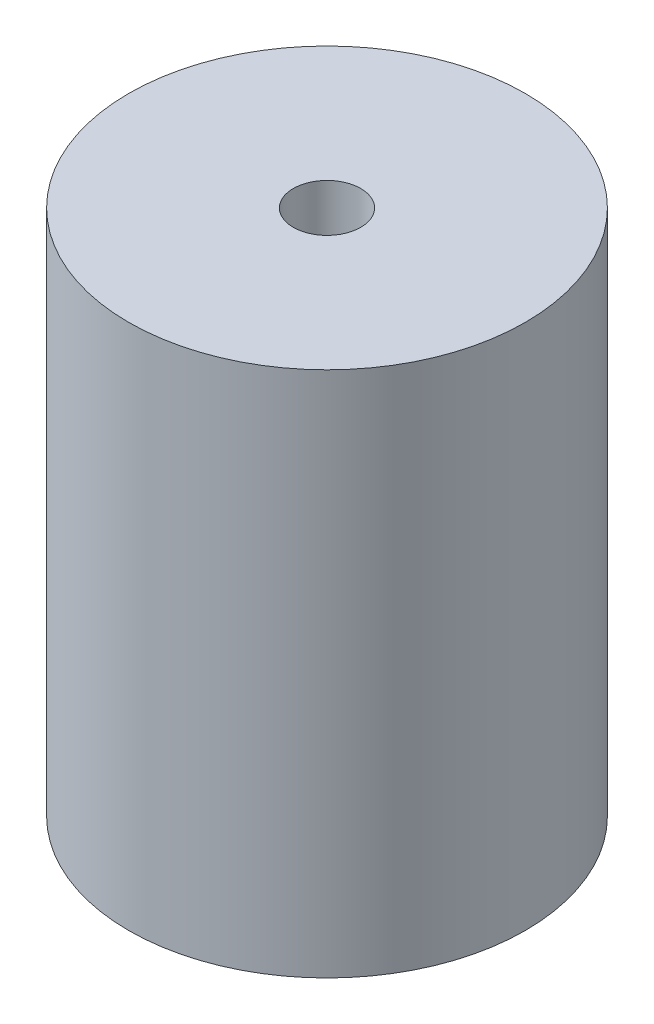
ISO-10303-21;
HEADER;
FILE_DESCRIPTION(('STEP AP214'),'2;1');
FILE_NAME('part.step','',(''),(''),'','','');
FILE_SCHEMA(('AUTOMOTIVE_DESIGN { 1 0 10303 214 1 1 1 1 }'));
ENDSEC;
DATA;
#1=APPLICATION_CONTEXT('core data for automotive mechanical design processes');
#2=APPLICATION_PROTOCOL_DEFINITION('international standard','automotive_design',2000,#1);
#3=PRODUCT_CONTEXT('',#1,'mechanical');
#4=PRODUCT('Part','Part','',(#3));
#5=PRODUCT_RELATED_PRODUCT_CATEGORY('part','',(#4));
#6=PRODUCT_DEFINITION_FORMATION('','',#4);
#7=PRODUCT_DEFINITION_CONTEXT('part definition',#1,'design');
#8=PRODUCT_DEFINITION('design','',#6,#7);
#9=PRODUCT_DEFINITION_SHAPE('','',#8);
#10=(LENGTH_UNIT() NAMED_UNIT(*) SI_UNIT(.MILLI.,.METRE.));
#11=(NAMED_UNIT(*) PLANE_ANGLE_UNIT() SI_UNIT($,.RADIAN.));
#12=(NAMED_UNIT(*) SI_UNIT($,.STERADIAN.) SOLID_ANGLE_UNIT());
#13=UNCERTAINTY_MEASURE_WITH_UNIT(LENGTH_MEASURE(1.E-05),#10,'distance_accuracy_value','');
#14=(GEOMETRIC_REPRESENTATION_CONTEXT(3) GLOBAL_UNCERTAINTY_ASSIGNED_CONTEXT((#13)) GLOBAL_UNIT_ASSIGNED_CONTEXT((#10,
#11,#12)) REPRESENTATION_CONTEXT('',''));
#15=CARTESIAN_POINT('',(0.,0.,0.));
#16=DIRECTION('',(0.,0.,1.));
#17=DIRECTION('',(1.,0.,0.));
#18=AXIS2_PLACEMENT_3D('',#15,#16,#17);
#19=CARTESIAN_POINT('',(0.,0.,0.));
#20=DIRECTION('',(0.,-1.,0.));
#21=DIRECTION('',(1.,0.,0.));
#22=AXIS2_PLACEMENT_3D('',#19,#20,#21);
#23=CYLINDRICAL_SURFACE('',#22,5.11833497263374);
#24=CARTESIAN_POINT('',(0.,23.6638405351553,0.));
#25=DIRECTION('',(0.,-1.,0.));
#26=DIRECTION('',(1.,0.,0.));
#27=AXIS2_PLACEMENT_3D('',#24,#25,#26);
#28=CIRCLE('',#27,5.11833497263374);
#29=CARTESIAN_POINT('',(5.11833497263374,23.6638405351553,0.));
#30=VERTEX_POINT('',#29);
#31=EDGE_CURVE('E60',#30,#30,#28,.T.);
#32=ORIENTED_EDGE('',*,*,#31,.T.);
#33=EDGE_LOOP('',(#32));
#34=FACE_BOUND('',#33,.T.);
#35=CARTESIAN_POINT('',(0.,43.6638405351553,0.));
#36=DIRECTION('',(0.,-1.,0.));
#37=DIRECTION('',(1.,0.,0.));
#38=AXIS2_PLACEMENT_3D('',#35,#36,#37);
#39=CIRCLE('',#38,5.11833497263374);
#40=CARTESIAN_POINT('',(5.11833497263374,43.6638405351553,0.));
#41=VERTEX_POINT('',#40);
#42=EDGE_CURVE('E10',#41,#41,#39,.T.);
#43=ORIENTED_EDGE('',*,*,#42,.F.);
#44=EDGE_LOOP('',(#43));
#45=FACE_BOUND('',#44,.T.);
#46=ADVANCED_FACE('F32',(#34,#45),#23,.F.);
#47=CARTESIAN_POINT('',(5.11833497263374,43.6638405351553,0.));
#48=DIRECTION('',(0.,1.,0.));
#49=DIRECTION('',(-1.,0.,0.));
#50=AXIS2_PLACEMENT_3D('',#47,#48,#49);
#51=PLANE('',#50);
#52=ORIENTED_EDGE('',*,*,#42,.T.);
#53=EDGE_LOOP('',(#52));
#54=FACE_BOUND('',#53,.T.);
#55=CARTESIAN_POINT('',(0.,43.6638405351553,0.));
#56=DIRECTION('',(0.,-1.,0.));
#57=DIRECTION('',(1.,0.,0.));
#58=AXIS2_PLACEMENT_3D('',#55,#56,#57);
#59=CIRCLE('',#58,30.1183349726337);
#60=CARTESIAN_POINT('',(30.1183349726337,43.6638405351553,0.));
#61=VERTEX_POINT('',#60);
#62=EDGE_CURVE('E38',#61,#61,#59,.T.);
#63=ORIENTED_EDGE('',*,*,#62,.F.);
#64=EDGE_LOOP('',(#63));
#65=FACE_BOUND('',#64,.T.);
#66=ADVANCED_FACE('F78',(#54,#65),#51,.T.);
#67=CARTESIAN_POINT('',(0.,0.,0.));
#68=DIRECTION('',(0.,-1.,0.));
#69=DIRECTION('',(1.,0.,0.));
#70=AXIS2_PLACEMENT_3D('',#67,#68,#69);
#71=CYLINDRICAL_SURFACE('',#70,30.1183349726337);
#72=ORIENTED_EDGE('',*,*,#62,.T.);
#73=EDGE_LOOP('',(#72));
#74=FACE_BOUND('',#73,.T.);
#75=CARTESIAN_POINT('',(0.,-36.3361594648447,0.));
#76=DIRECTION('',(0.,-1.,0.));
#77=DIRECTION('',(1.,0.,0.));
#78=AXIS2_PLACEMENT_3D('',#75,#76,#77);
#79=CIRCLE('',#78,30.1183349726337);
#80=CARTESIAN_POINT('',(30.1183349726337,-36.3361594648447,0.));
#81=VERTEX_POINT('',#80);
#82=EDGE_CURVE('E42',#81,#81,#79,.T.);
#83=ORIENTED_EDGE('',*,*,#82,.F.);
#84=EDGE_LOOP('',(#83));
#85=FACE_BOUND('',#84,.T.);
#86=ADVANCED_FACE('F82',(#74,#85),#71,.T.);
#87=CARTESIAN_POINT('',(30.1183349726337,-36.3361594648447,0.));
#88=DIRECTION('',(0.,-1.,0.));
#89=DIRECTION('',(1.,0.,0.));
#90=AXIS2_PLACEMENT_3D('',#87,#88,#89);
#91=PLANE('',#90);
#92=ORIENTED_EDGE('',*,*,#82,.T.);
#93=EDGE_LOOP('',(#92));
#94=FACE_BOUND('',#93,.T.);
#95=CARTESIAN_POINT('',(0.,-36.3361594648447,0.));
#96=DIRECTION('',(0.,-1.,0.));
#97=DIRECTION('',(1.,0.,0.));
#98=AXIS2_PLACEMENT_3D('',#95,#96,#97);
#99=CIRCLE('',#98,5.11833497263374);
#100=CARTESIAN_POINT('',(5.11833497263374,-36.3361594648447,0.));
#101=VERTEX_POINT('',#100);
#102=EDGE_CURVE('E46',#101,#101,#99,.T.);
#103=ORIENTED_EDGE('',*,*,#102,.F.);
#104=EDGE_LOOP('',(#103));
#105=FACE_BOUND('',#104,.T.);
#106=ADVANCED_FACE('F86',(#94,#105),#91,.T.);
#107=CARTESIAN_POINT('',(0.,0.,0.));
#108=DIRECTION('',(0.,-1.,0.));
#109=DIRECTION('',(1.,0.,0.));
#110=AXIS2_PLACEMENT_3D('',#107,#108,#109);
#111=CYLINDRICAL_SURFACE('',#110,5.11833497263374);
#112=ORIENTED_EDGE('',*,*,#102,.T.);
#113=EDGE_LOOP('',(#112));
#114=FACE_BOUND('',#113,.T.);
#115=CARTESIAN_POINT('',(0.,-16.3361594648447,0.));
#116=DIRECTION('',(0.,-1.,0.));
#117=DIRECTION('',(1.,0.,0.));
#118=AXIS2_PLACEMENT_3D('',#115,#116,#117);
#119=CIRCLE('',#118,5.11833497263374);
#120=CARTESIAN_POINT('',(5.11833497263374,-16.3361594648447,0.));
#121=VERTEX_POINT('',#120);
#122=EDGE_CURVE('E51',#121,#121,#119,.T.);
#123=ORIENTED_EDGE('',*,*,#122,.F.);
#124=EDGE_LOOP('',(#123));
#125=FACE_BOUND('',#124,.T.);
#126=ADVANCED_FACE('F92',(#114,#125),#111,.F.);
#127=CARTESIAN_POINT('',(5.11833497263374,-16.3361594648447,0.));
#128=DIRECTION('',(0.,1.,0.));
#129=DIRECTION('',(-1.,0.,0.));
#130=AXIS2_PLACEMENT_3D('',#127,#128,#129);
#131=PLANE('',#130);
#132=ORIENTED_EDGE('',*,*,#122,.T.);
#133=EDGE_LOOP('',(#132));
#134=FACE_BOUND('',#133,.T.);
#135=CARTESIAN_POINT('',(0.,-16.3361594648447,0.));
#136=DIRECTION('',(0.,-1.,0.));
#137=DIRECTION('',(1.,0.,0.));
#138=AXIS2_PLACEMENT_3D('',#135,#136,#137);
#139=CIRCLE('',#138,20.1183349726337);
#140=CARTESIAN_POINT('',(20.1183349726337,-16.3361594648447,0.));
#141=VERTEX_POINT('',#140);
#142=EDGE_CURVE('E54',#141,#141,#139,.T.);
#143=ORIENTED_EDGE('',*,*,#142,.F.);
#144=EDGE_LOOP('',(#143));
#145=FACE_BOUND('',#144,.T.);
#146=ADVANCED_FACE('F74',(#134,#145),#131,.T.);
#147=CARTESIAN_POINT('',(0.,0.,0.));
#148=DIRECTION('',(0.,-1.,0.));
#149=DIRECTION('',(1.,0.,0.));
#150=AXIS2_PLACEMENT_3D('',#147,#148,#149);
#151=CYLINDRICAL_SURFACE('',#150,20.1183349726337);
#152=ORIENTED_EDGE('',*,*,#142,.T.);
#153=EDGE_LOOP('',(#152));
#154=FACE_BOUND('',#153,.T.);
#155=CARTESIAN_POINT('',(0.,23.6638405351553,0.));
#156=DIRECTION('',(0.,-1.,0.));
#157=DIRECTION('',(1.,0.,0.));
#158=AXIS2_PLACEMENT_3D('',#155,#156,#157);
#159=CIRCLE('',#158,20.1183349726337);
#160=CARTESIAN_POINT('',(20.1183349726337,23.6638405351553,0.));
#161=VERTEX_POINT('',#160);
#162=EDGE_CURVE('E57',#161,#161,#159,.T.);
#163=ORIENTED_EDGE('',*,*,#162,.F.);
#164=EDGE_LOOP('',(#163));
#165=FACE_BOUND('',#164,.T.);
#166=ADVANCED_FACE('F68',(#154,#165),#151,.F.);
#167=CARTESIAN_POINT('',(20.1183349726337,23.6638405351553,0.));
#168=DIRECTION('',(0.,-1.,0.));
#169=DIRECTION('',(1.,0.,0.));
#170=AXIS2_PLACEMENT_3D('',#167,#168,#169);
#171=PLANE('',#170);
#172=ORIENTED_EDGE('',*,*,#162,.T.);
#173=EDGE_LOOP('',(#172));
#174=FACE_BOUND('',#173,.T.);
#175=ORIENTED_EDGE('',*,*,#31,.F.);
#176=EDGE_LOOP('',(#175));
#177=FACE_BOUND('',#176,.T.);
#178=ADVANCED_FACE('F66',(#174,#177),#171,.T.);
#179=CLOSED_SHELL('',(#46,#66,#86,#106,#126,#146,#166,#178));
#180=MANIFOLD_SOLID_BREP('B2',#179);
#181=ADVANCED_BREP_SHAPE_REPRESENTATION('',(#18,#180),#14);
#182=SHAPE_DEFINITION_REPRESENTATION(#9,#181);
ENDSEC;
END-ISO-10303-21;
